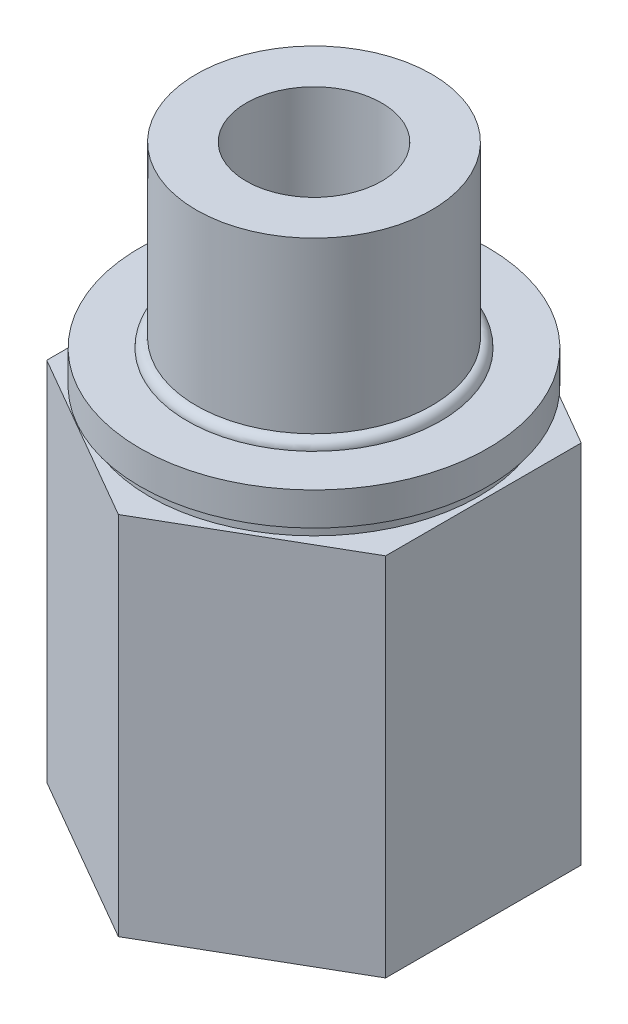
ISO-10303-21;
HEADER;
FILE_DESCRIPTION(('STEP AP214'),'2;1');
FILE_NAME('part.step','',(''),(''),'','','');
FILE_SCHEMA(('AUTOMOTIVE_DESIGN { 1 0 10303 214 1 1 1 1 }'));
ENDSEC;
DATA;
#1=APPLICATION_CONTEXT('core data for automotive mechanical design processes');
#2=APPLICATION_PROTOCOL_DEFINITION('international standard','automotive_design',2000,#1);
#3=PRODUCT_CONTEXT('',#1,'mechanical');
#4=PRODUCT('Part','Part','',(#3));
#5=PRODUCT_RELATED_PRODUCT_CATEGORY('part','',(#4));
#6=PRODUCT_DEFINITION_FORMATION('','',#4);
#7=PRODUCT_DEFINITION_CONTEXT('part definition',#1,'design');
#8=PRODUCT_DEFINITION('design','',#6,#7);
#9=PRODUCT_DEFINITION_SHAPE('','',#8);
#10=(LENGTH_UNIT() NAMED_UNIT(*) SI_UNIT(.MILLI.,.METRE.));
#11=(NAMED_UNIT(*) PLANE_ANGLE_UNIT() SI_UNIT($,.RADIAN.));
#12=(NAMED_UNIT(*) SI_UNIT($,.STERADIAN.) SOLID_ANGLE_UNIT());
#13=UNCERTAINTY_MEASURE_WITH_UNIT(LENGTH_MEASURE(1.E-05),#10,'distance_accuracy_value','');
#14=(GEOMETRIC_REPRESENTATION_CONTEXT(3) GLOBAL_UNCERTAINTY_ASSIGNED_CONTEXT((#13)) GLOBAL_UNIT_ASSIGNED_CONTEXT((#10,
#11,#12)) REPRESENTATION_CONTEXT('',''));
#15=CARTESIAN_POINT('',(0.,0.,0.));
#16=DIRECTION('',(0.,0.,1.));
#17=DIRECTION('',(1.,0.,0.));
#18=AXIS2_PLACEMENT_3D('',#15,#16,#17);
#19=CARTESIAN_POINT('',(0.,23.1,0.));
#20=DIRECTION('',(0.,1.,0.));
#21=DIRECTION('',(0.,0.,1.));
#22=AXIS2_PLACEMENT_3D('',#19,#20,#21);
#23=PLANE('',#22);
#24=CARTESIAN_POINT('',(0.,23.1,0.));
#25=DIRECTION('',(0.,1.,0.));
#26=DIRECTION('',(0.,0.,1.));
#27=AXIS2_PLACEMENT_3D('',#24,#25,#26);
#28=CIRCLE('',#27,9.75);
#29=CARTESIAN_POINT('',(0.,23.1,9.75));
#30=VERTEX_POINT('',#29);
#31=EDGE_CURVE('E163',#30,#30,#28,.T.);
#32=ORIENTED_EDGE('',*,*,#31,.T.);
#33=EDGE_LOOP('',(#32));
#34=FACE_BOUND('',#33,.T.);
#35=CARTESIAN_POINT('',(0.,23.1,0.));
#36=DIRECTION('',(0.,-1.,0.));
#37=DIRECTION('',(0.,0.,-1.));
#38=AXIS2_PLACEMENT_3D('',#35,#36,#37);
#39=CIRCLE('',#38,7.1);
#40=CARTESIAN_POINT('',(0.,23.1,-7.1));
#41=VERTEX_POINT('',#40);
#42=EDGE_CURVE('E156',#41,#41,#39,.T.);
#43=ORIENTED_EDGE('',*,*,#42,.T.);
#44=EDGE_LOOP('',(#43));
#45=FACE_BOUND('',#44,.T.);
#46=ADVANCED_FACE('F36',(#34,#45),#23,.T.);
#47=CARTESIAN_POINT('',(0.,33.1,0.));
#48=DIRECTION('',(0.,-1.,0.));
#49=DIRECTION('',(0.,0.,-1.));
#50=AXIS2_PLACEMENT_3D('',#47,#48,#49);
#51=CYLINDRICAL_SURFACE('',#50,6.6);
#52=CARTESIAN_POINT('',(0.,33.1,0.));
#53=DIRECTION('',(0.,1.,0.));
#54=DIRECTION('',(0.,0.,1.));
#55=AXIS2_PLACEMENT_3D('',#52,#53,#54);
#56=CIRCLE('',#55,6.6);
#57=CARTESIAN_POINT('',(0.,33.1,6.6));
#58=VERTEX_POINT('',#57);
#59=EDGE_CURVE('E148',#58,#58,#56,.T.);
#60=ORIENTED_EDGE('',*,*,#59,.F.);
#61=EDGE_LOOP('',(#60));
#62=FACE_BOUND('',#61,.T.);
#63=CARTESIAN_POINT('',(0.,23.6,0.));
#64=DIRECTION('',(0.,-1.,0.));
#65=DIRECTION('',(0.,0.,-1.));
#66=AXIS2_PLACEMENT_3D('',#63,#64,#65);
#67=CIRCLE('',#66,6.6);
#68=CARTESIAN_POINT('',(0.,23.6,-6.6));
#69=VERTEX_POINT('',#68);
#70=EDGE_CURVE('E11',#69,#69,#67,.T.);
#71=ORIENTED_EDGE('',*,*,#70,.F.);
#72=EDGE_LOOP('',(#71));
#73=FACE_BOUND('',#72,.T.);
#74=ADVANCED_FACE('F196',(#62,#73),#51,.T.);
#75=CARTESIAN_POINT('',(0.,0.,0.));
#76=DIRECTION('',(0.,1.,0.));
#77=DIRECTION('',(0.,0.,1.));
#78=AXIS2_PLACEMENT_3D('',#75,#76,#77);
#79=CYLINDRICAL_SURFACE('',#78,3.8);
#80=CARTESIAN_POINT('',(0.,33.1,0.));
#81=DIRECTION('',(0.,1.,0.));
#82=DIRECTION('',(0.,0.,1.));
#83=AXIS2_PLACEMENT_3D('',#80,#81,#82);
#84=CIRCLE('',#83,3.8);
#85=CARTESIAN_POINT('',(0.,33.1,3.8));
#86=VERTEX_POINT('',#85);
#87=EDGE_CURVE('E143',#86,#86,#84,.T.);
#88=ORIENTED_EDGE('',*,*,#87,.T.);
#89=EDGE_LOOP('',(#88));
#90=FACE_BOUND('',#89,.T.);
#91=CARTESIAN_POINT('',(0.,16.5,0.));
#92=DIRECTION('',(0.,-1.,0.));
#93=DIRECTION('',(0.,0.,-1.));
#94=AXIS2_PLACEMENT_3D('',#91,#92,#93);
#95=CIRCLE('',#94,3.8);
#96=CARTESIAN_POINT('',(0.,16.5,-3.8));
#97=VERTEX_POINT('',#96);
#98=EDGE_CURVE('E141',#97,#97,#95,.F.);
#99=ORIENTED_EDGE('',*,*,#98,.F.);
#100=EDGE_LOOP('',(#99));
#101=FACE_BOUND('',#100,.T.);
#102=ADVANCED_FACE('F202',(#90,#101),#79,.F.);
#103=CARTESIAN_POINT('',(0.,20.5,0.));
#104=DIRECTION('',(0.,1.,0.));
#105=DIRECTION('',(0.,0.,1.));
#106=AXIS2_PLACEMENT_3D('',#103,#104,#105);
#107=PLANE('',#106);
#108=DIRECTION('',(-0.866025403784438,0.,-0.5));
#109=VECTOR('',#108,1.);
#110=CARTESIAN_POINT('',(9.5,20.5,-5.48482755730145));
#111=LINE('',#110,#109);
#112=CARTESIAN_POINT('',(9.5,20.5,-5.48482755730145));
#113=VERTEX_POINT('',#112);
#114=CARTESIAN_POINT('',(0.,20.5,-10.9696551146029));
#115=VERTEX_POINT('',#114);
#116=EDGE_CURVE('E134',#113,#115,#111,.T.);
#117=ORIENTED_EDGE('',*,*,#116,.T.);
#118=DIRECTION('',(-0.866025403784438,0.,0.5));
#119=VECTOR('',#118,1.);
#120=CARTESIAN_POINT('',(0.,20.5,-10.9696551146029));
#121=LINE('',#120,#119);
#122=CARTESIAN_POINT('',(-9.5,20.5,-5.48482755730144));
#123=VERTEX_POINT('',#122);
#124=EDGE_CURVE('E91',#115,#123,#121,.T.);
#125=ORIENTED_EDGE('',*,*,#124,.T.);
#126=DIRECTION('',(0.,0.,1.));
#127=VECTOR('',#126,1.);
#128=CARTESIAN_POINT('',(-9.5,20.5,-5.48482755730144));
#129=LINE('',#128,#127);
#130=CARTESIAN_POINT('',(-9.5,20.5,5.48482755730145));
#131=VERTEX_POINT('',#130);
#132=EDGE_CURVE('E105',#123,#131,#129,.T.);
#133=ORIENTED_EDGE('',*,*,#132,.T.);
#134=DIRECTION('',(0.866025403784439,0.,0.5));
#135=VECTOR('',#134,1.);
#136=CARTESIAN_POINT('',(-9.5,20.5,5.48482755730145));
#137=LINE('',#136,#135);
#138=CARTESIAN_POINT('',(0.,20.5,10.9696551146029));
#139=VERTEX_POINT('',#138);
#140=EDGE_CURVE('E98',#131,#139,#137,.T.);
#141=ORIENTED_EDGE('',*,*,#140,.T.);
#142=DIRECTION('',(0.866025403784438,0.,-0.5));
#143=VECTOR('',#142,1.);
#144=CARTESIAN_POINT('',(0.,20.5,10.9696551146029));
#145=LINE('',#144,#143);
#146=CARTESIAN_POINT('',(9.5,20.5,5.48482755730144));
#147=VERTEX_POINT('',#146);
#148=EDGE_CURVE('E103',#139,#147,#145,.T.);
#149=ORIENTED_EDGE('',*,*,#148,.T.);
#150=DIRECTION('',(0.,0.,-1.));
#151=VECTOR('',#150,1.);
#152=CARTESIAN_POINT('',(9.5,20.5,5.48482755730144));
#153=LINE('',#152,#151);
#154=EDGE_CURVE('E53',#147,#113,#153,.T.);
#155=ORIENTED_EDGE('',*,*,#154,.T.);
#156=EDGE_LOOP('',(#117,#125,#133,#141,#149,#155));
#157=FACE_BOUND('',#156,.T.);
#158=CARTESIAN_POINT('',(0.,20.5,0.));
#159=DIRECTION('',(0.,1.,0.));
#160=DIRECTION('',(0.,0.,1.));
#161=AXIS2_PLACEMENT_3D('',#158,#159,#160);
#162=CIRCLE('',#161,9.225);
#163=CARTESIAN_POINT('',(0.,20.5,9.225));
#164=VERTEX_POINT('',#163);
#165=EDGE_CURVE('E166',#164,#164,#162,.T.);
#166=ORIENTED_EDGE('',*,*,#165,.F.);
#167=EDGE_LOOP('',(#166));
#168=FACE_BOUND('',#167,.T.);
#169=ADVANCED_FACE('F100',(#157,#168),#107,.T.);
#170=CARTESIAN_POINT('',(9.5,20.5,-5.48482755730145));
#171=DIRECTION('',(-0.5,0.,0.866025403784439));
#172=DIRECTION('',(0.866025403784439,0.,0.5));
#173=AXIS2_PLACEMENT_3D('',#170,#171,#172);
#174=PLANE('',#173);
#175=DIRECTION('',(-0.866025403784438,0.,-0.5));
#176=VECTOR('',#175,1.);
#177=CARTESIAN_POINT('',(9.5,0.,-5.48482755730145));
#178=LINE('',#177,#176);
#179=CARTESIAN_POINT('',(9.5,0.,-5.48482755730145));
#180=VERTEX_POINT('',#179);
#181=CARTESIAN_POINT('',(0.,0.,-10.9696551146029));
#182=VERTEX_POINT('',#181);
#183=EDGE_CURVE('E123',#180,#182,#178,.T.);
#184=ORIENTED_EDGE('',*,*,#183,.T.);
#185=DIRECTION('',(0.,-1.,0.));
#186=VECTOR('',#185,1.);
#187=CARTESIAN_POINT('',(0.,20.5,-10.9696551146029));
#188=LINE('',#187,#186);
#189=EDGE_CURVE('E45',#115,#182,#188,.T.);
#190=ORIENTED_EDGE('',*,*,#189,.F.);
#191=ORIENTED_EDGE('',*,*,#116,.F.);
#192=DIRECTION('',(0.,-1.,0.));
#193=VECTOR('',#192,1.);
#194=CARTESIAN_POINT('',(9.5,20.5,-5.48482755730145));
#195=LINE('',#194,#193);
#196=EDGE_CURVE('E119',#113,#180,#195,.T.);
#197=ORIENTED_EDGE('',*,*,#196,.T.);
#198=EDGE_LOOP('',(#184,#190,#191,#197));
#199=FACE_BOUND('',#198,.T.);
#200=ADVANCED_FACE('F38',(#199),#174,.F.);
#201=CARTESIAN_POINT('',(0.,20.5,-10.9696551146029));
#202=DIRECTION('',(0.5,0.,0.866025403784439));
#203=DIRECTION('',(0.866025403784438,0.,-0.5));
#204=AXIS2_PLACEMENT_3D('',#201,#202,#203);
#205=PLANE('',#204);
#206=DIRECTION('',(-0.866025403784438,0.,0.5));
#207=VECTOR('',#206,1.);
#208=CARTESIAN_POINT('',(0.,0.,-10.9696551146029));
#209=LINE('',#208,#207);
#210=CARTESIAN_POINT('',(-9.5,0.,-5.48482755730144));
#211=VERTEX_POINT('',#210);
#212=EDGE_CURVE('E126',#182,#211,#209,.T.);
#213=ORIENTED_EDGE('',*,*,#212,.T.);
#214=DIRECTION('',(0.,-1.,0.));
#215=VECTOR('',#214,1.);
#216=CARTESIAN_POINT('',(-9.5,20.5,-5.48482755730144));
#217=LINE('',#216,#215);
#218=EDGE_CURVE('E138',#123,#211,#217,.T.);
#219=ORIENTED_EDGE('',*,*,#218,.F.);
#220=ORIENTED_EDGE('',*,*,#124,.F.);
#221=ORIENTED_EDGE('',*,*,#189,.T.);
#222=EDGE_LOOP('',(#213,#219,#220,#221));
#223=FACE_BOUND('',#222,.T.);
#224=ADVANCED_FACE('F176',(#223),#205,.F.);
#225=CARTESIAN_POINT('',(-9.5,20.5,-5.48482755730144));
#226=DIRECTION('',(1.,0.,0.));
#227=DIRECTION('',(0.,0.,-1.));
#228=AXIS2_PLACEMENT_3D('',#225,#226,#227);
#229=PLANE('',#228);
#230=DIRECTION('',(0.,0.,1.));
#231=VECTOR('',#230,1.);
#232=CARTESIAN_POINT('',(-9.5,0.,-5.48482755730144));
#233=LINE('',#232,#231);
#234=CARTESIAN_POINT('',(-9.5,0.,5.48482755730145));
#235=VERTEX_POINT('',#234);
#236=EDGE_CURVE('E129',#211,#235,#233,.T.);
#237=ORIENTED_EDGE('',*,*,#236,.T.);
#238=DIRECTION('',(0.,-1.,0.));
#239=VECTOR('',#238,1.);
#240=CARTESIAN_POINT('',(-9.5,20.5,5.48482755730145));
#241=LINE('',#240,#239);
#242=EDGE_CURVE('E114',#131,#235,#241,.T.);
#243=ORIENTED_EDGE('',*,*,#242,.F.);
#244=ORIENTED_EDGE('',*,*,#132,.F.);
#245=ORIENTED_EDGE('',*,*,#218,.T.);
#246=EDGE_LOOP('',(#237,#243,#244,#245));
#247=FACE_BOUND('',#246,.T.);
#248=ADVANCED_FACE('F179',(#247),#229,.F.);
#249=CARTESIAN_POINT('',(-9.5,20.5,5.48482755730145));
#250=DIRECTION('',(0.5,0.,-0.866025403784439));
#251=DIRECTION('',(-0.866025403784439,0.,-0.5));
#252=AXIS2_PLACEMENT_3D('',#249,#250,#251);
#253=PLANE('',#252);
#254=DIRECTION('',(0.866025403784439,0.,0.5));
#255=VECTOR('',#254,1.);
#256=CARTESIAN_POINT('',(-9.5,0.,5.48482755730145));
#257=LINE('',#256,#255);
#258=CARTESIAN_POINT('',(0.,0.,10.9696551146029));
#259=VERTEX_POINT('',#258);
#260=EDGE_CURVE('E113',#235,#259,#257,.T.);
#261=ORIENTED_EDGE('',*,*,#260,.T.);
#262=DIRECTION('',(0.,-1.,0.));
#263=VECTOR('',#262,1.);
#264=CARTESIAN_POINT('',(0.,20.5,10.9696551146029));
#265=LINE('',#264,#263);
#266=EDGE_CURVE('E110',#139,#259,#265,.T.);
#267=ORIENTED_EDGE('',*,*,#266,.F.);
#268=ORIENTED_EDGE('',*,*,#140,.F.);
#269=ORIENTED_EDGE('',*,*,#242,.T.);
#270=EDGE_LOOP('',(#261,#267,#268,#269));
#271=FACE_BOUND('',#270,.T.);
#272=ADVANCED_FACE('F111',(#271),#253,.F.);
#273=CARTESIAN_POINT('',(0.,20.5,10.9696551146029));
#274=DIRECTION('',(-0.5,0.,-0.866025403784439));
#275=DIRECTION('',(-0.866025403784438,0.,0.5));
#276=AXIS2_PLACEMENT_3D('',#273,#274,#275);
#277=PLANE('',#276);
#278=DIRECTION('',(0.866025403784438,0.,-0.5));
#279=VECTOR('',#278,1.);
#280=CARTESIAN_POINT('',(0.,0.,10.9696551146029));
#281=LINE('',#280,#279);
#282=CARTESIAN_POINT('',(9.5,0.,5.48482755730144));
#283=VERTEX_POINT('',#282);
#284=EDGE_CURVE('E76',#259,#283,#281,.T.);
#285=ORIENTED_EDGE('',*,*,#284,.T.);
#286=DIRECTION('',(0.,-1.,0.));
#287=VECTOR('',#286,1.);
#288=CARTESIAN_POINT('',(9.5,20.5,5.48482755730144));
#289=LINE('',#288,#287);
#290=EDGE_CURVE('E115',#147,#283,#289,.T.);
#291=ORIENTED_EDGE('',*,*,#290,.F.);
#292=ORIENTED_EDGE('',*,*,#148,.F.);
#293=ORIENTED_EDGE('',*,*,#266,.T.);
#294=EDGE_LOOP('',(#285,#291,#292,#293));
#295=FACE_BOUND('',#294,.T.);
#296=ADVANCED_FACE('F117',(#295),#277,.F.);
#297=CARTESIAN_POINT('',(9.5,20.5,5.48482755730144));
#298=DIRECTION('',(-1.,0.,0.));
#299=DIRECTION('',(0.,0.,1.));
#300=AXIS2_PLACEMENT_3D('',#297,#298,#299);
#301=PLANE('',#300);
#302=DIRECTION('',(0.,0.,-1.));
#303=VECTOR('',#302,1.);
#304=CARTESIAN_POINT('',(9.5,0.,5.48482755730144));
#305=LINE('',#304,#303);
#306=EDGE_CURVE('E82',#283,#180,#305,.T.);
#307=ORIENTED_EDGE('',*,*,#306,.T.);
#308=ORIENTED_EDGE('',*,*,#196,.F.);
#309=ORIENTED_EDGE('',*,*,#154,.F.);
#310=ORIENTED_EDGE('',*,*,#290,.T.);
#311=EDGE_LOOP('',(#307,#308,#309,#310));
#312=FACE_BOUND('',#311,.T.);
#313=ADVANCED_FACE('F184',(#312),#301,.F.);
#314=CARTESIAN_POINT('',(0.,0.,0.));
#315=DIRECTION('',(0.,1.,0.));
#316=DIRECTION('',(0.,0.,1.));
#317=AXIS2_PLACEMENT_3D('',#314,#315,#316);
#318=PLANE('',#317);
#319=CARTESIAN_POINT('',(0.,0.,0.));
#320=DIRECTION('',(0.,-1.,0.));
#321=DIRECTION('',(0.,0.,-1.));
#322=AXIS2_PLACEMENT_3D('',#319,#320,#321);
#323=CIRCLE('',#322,5.5);
#324=CARTESIAN_POINT('',(0.,0.,-5.5));
#325=VERTEX_POINT('',#324);
#326=EDGE_CURVE('E151',#325,#325,#323,.T.);
#327=ORIENTED_EDGE('',*,*,#326,.F.);
#328=EDGE_LOOP('',(#327));
#329=FACE_BOUND('',#328,.T.);
#330=ORIENTED_EDGE('',*,*,#183,.F.);
#331=ORIENTED_EDGE('',*,*,#306,.F.);
#332=ORIENTED_EDGE('',*,*,#284,.F.);
#333=ORIENTED_EDGE('',*,*,#260,.F.);
#334=ORIENTED_EDGE('',*,*,#236,.F.);
#335=ORIENTED_EDGE('',*,*,#212,.F.);
#336=EDGE_LOOP('',(#330,#331,#332,#333,#334,#335));
#337=FACE_BOUND('',#336,.T.);
#338=ADVANCED_FACE('F182',(#329,#337),#318,.F.);
#339=CARTESIAN_POINT('',(0.,21.25,0.));
#340=DIRECTION('',(0.,-1.,0.));
#341=DIRECTION('',(0.,0.,-1.));
#342=AXIS2_PLACEMENT_3D('',#339,#340,#341);
#343=CYLINDRICAL_SURFACE('',#342,9.225);
#344=CARTESIAN_POINT('',(0.,21.25,0.));
#345=DIRECTION('',(0.,1.,0.));
#346=DIRECTION('',(0.,0.,1.));
#347=AXIS2_PLACEMENT_3D('',#344,#345,#346);
#348=CIRCLE('',#347,9.225);
#349=CARTESIAN_POINT('',(0.,21.25,9.225));
#350=VERTEX_POINT('',#349);
#351=EDGE_CURVE('E127',#350,#350,#348,.T.);
#352=ORIENTED_EDGE('',*,*,#351,.F.);
#353=EDGE_LOOP('',(#352));
#354=FACE_BOUND('',#353,.T.);
#355=ORIENTED_EDGE('',*,*,#165,.T.);
#356=EDGE_LOOP('',(#355));
#357=FACE_BOUND('',#356,.T.);
#358=ADVANCED_FACE('F191',(#354,#357),#343,.T.);
#359=CARTESIAN_POINT('',(0.,21.25,0.));
#360=DIRECTION('',(0.,1.,0.));
#361=DIRECTION('',(0.,0.,1.));
#362=AXIS2_PLACEMENT_3D('',#359,#360,#361);
#363=PLANE('',#362);
#364=CARTESIAN_POINT('',(0.,21.25,0.));
#365=DIRECTION('',(0.,1.,0.));
#366=DIRECTION('',(0.,0.,1.));
#367=AXIS2_PLACEMENT_3D('',#364,#365,#366);
#368=CIRCLE('',#367,9.75);
#369=CARTESIAN_POINT('',(0.,21.25,9.75));
#370=VERTEX_POINT('',#369);
#371=EDGE_CURVE('E162',#370,#370,#368,.T.);
#372=ORIENTED_EDGE('',*,*,#371,.F.);
#373=EDGE_LOOP('',(#372));
#374=FACE_BOUND('',#373,.T.);
#375=ORIENTED_EDGE('',*,*,#351,.T.);
#376=EDGE_LOOP('',(#375));
#377=FACE_BOUND('',#376,.T.);
#378=ADVANCED_FACE('F208',(#374,#377),#363,.F.);
#379=CARTESIAN_POINT('',(0.,23.1,0.));
#380=DIRECTION('',(0.,-1.,0.));
#381=DIRECTION('',(0.,0.,-1.));
#382=AXIS2_PLACEMENT_3D('',#379,#380,#381);
#383=CYLINDRICAL_SURFACE('',#382,9.75);
#384=ORIENTED_EDGE('',*,*,#31,.F.);
#385=EDGE_LOOP('',(#384));
#386=FACE_BOUND('',#385,.T.);
#387=ORIENTED_EDGE('',*,*,#371,.T.);
#388=EDGE_LOOP('',(#387));
#389=FACE_BOUND('',#388,.T.);
#390=ADVANCED_FACE('F211',(#386,#389),#383,.T.);
#391=CARTESIAN_POINT('',(0.,33.1,0.));
#392=DIRECTION('',(0.,1.,0.));
#393=DIRECTION('',(0.,0.,1.));
#394=AXIS2_PLACEMENT_3D('',#391,#392,#393);
#395=PLANE('',#394);
#396=ORIENTED_EDGE('',*,*,#87,.F.);
#397=EDGE_LOOP('',(#396));
#398=FACE_BOUND('',#397,.T.);
#399=ORIENTED_EDGE('',*,*,#59,.T.);
#400=EDGE_LOOP('',(#399));
#401=FACE_BOUND('',#400,.T.);
#402=ADVANCED_FACE('F215',(#398,#401),#395,.T.);
#403=CARTESIAN_POINT('',(0.,16.5,0.));
#404=DIRECTION('',(0.,-1.,0.));
#405=DIRECTION('',(0.,0.,-1.));
#406=AXIS2_PLACEMENT_3D('',#403,#404,#405);
#407=PLANE('',#406);
#408=CARTESIAN_POINT('',(0.,16.5,0.));
#409=DIRECTION('',(0.,-1.,0.));
#410=DIRECTION('',(0.,0.,-1.));
#411=AXIS2_PLACEMENT_3D('',#408,#409,#410);
#412=CIRCLE('',#411,5.5);
#413=CARTESIAN_POINT('',(0.,16.5,-5.5));
#414=VERTEX_POINT('',#413);
#415=EDGE_CURVE('E144',#414,#414,#412,.T.);
#416=ORIENTED_EDGE('',*,*,#415,.T.);
#417=EDGE_LOOP('',(#416));
#418=FACE_BOUND('',#417,.T.);
#419=ORIENTED_EDGE('',*,*,#98,.T.);
#420=EDGE_LOOP('',(#419));
#421=FACE_BOUND('',#420,.T.);
#422=ADVANCED_FACE('F234',(#418,#421),#407,.T.);
#423=CARTESIAN_POINT('',(0.,16.5,0.));
#424=DIRECTION('',(0.,-1.,0.));
#425=DIRECTION('',(0.,0.,-1.));
#426=AXIS2_PLACEMENT_3D('',#423,#424,#425);
#427=CYLINDRICAL_SURFACE('',#426,5.5);
#428=ORIENTED_EDGE('',*,*,#415,.F.);
#429=EDGE_LOOP('',(#428));
#430=FACE_BOUND('',#429,.T.);
#431=ORIENTED_EDGE('',*,*,#326,.T.);
#432=EDGE_LOOP('',(#431));
#433=FACE_BOUND('',#432,.T.);
#434=ADVANCED_FACE('F231',(#430,#433),#427,.F.);
#435=CARTESIAN_POINT('',(0.,23.1,0.));
#436=DIRECTION('',(0.,-1.,0.));
#437=DIRECTION('',(0.,0.,-1.));
#438=AXIS2_PLACEMENT_3D('',#435,#436,#437);
#439=TOROIDAL_SURFACE('',#438,6.6,0.5);
#440=ORIENTED_EDGE('',*,*,#42,.F.);
#441=EDGE_LOOP('',(#440));
#442=FACE_BOUND('',#441,.T.);
#443=ORIENTED_EDGE('',*,*,#70,.T.);
#444=EDGE_LOOP('',(#443));
#445=FACE_BOUND('',#444,.T.);
#446=ADVANCED_FACE('F245',(#442,#445),#439,.T.);
#447=CLOSED_SHELL('',(#46,#74,#102,#169,#200,#224,#248,#272,#296,#313,#338,#358,#378,#390,#402,
#422,#434,#446));
#448=MANIFOLD_SOLID_BREP('B2',#447);
#449=ADVANCED_BREP_SHAPE_REPRESENTATION('',(#18,#448),#14);
#450=SHAPE_DEFINITION_REPRESENTATION(#9,#449);
ENDSEC;
END-ISO-10303-21;
